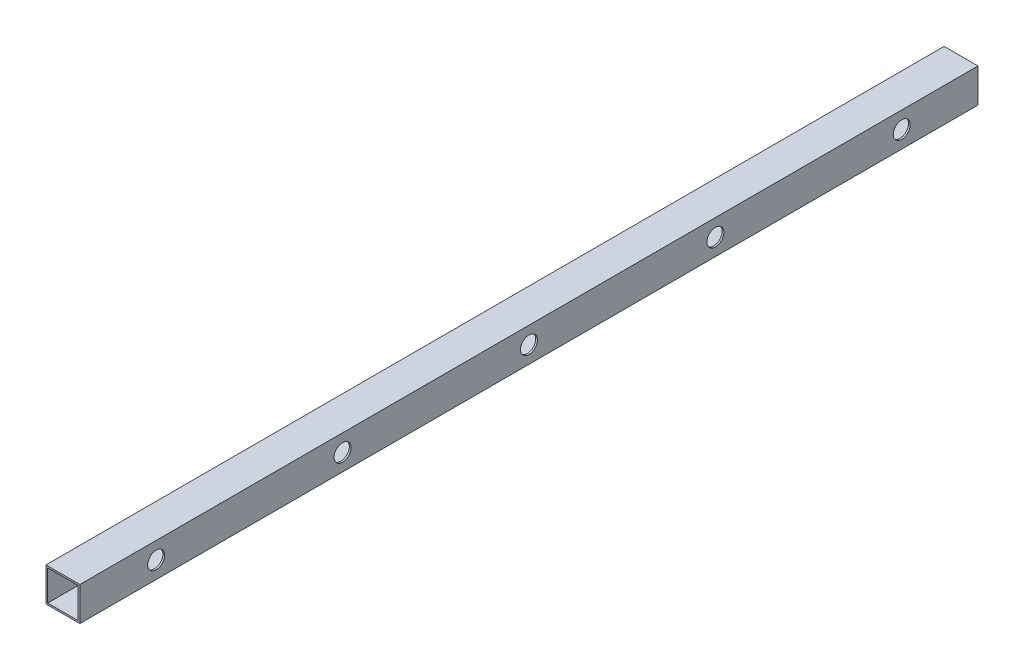
ISO-10303-21;
HEADER;
FILE_DESCRIPTION(('STEP AP214'),'2;1');
FILE_NAME('part.step','',(''),(''),'','','');
FILE_SCHEMA(('AUTOMOTIVE_DESIGN { 1 0 10303 214 1 1 1 1 }'));
ENDSEC;
DATA;
#1=APPLICATION_CONTEXT('core data for automotive mechanical design processes');
#2=APPLICATION_PROTOCOL_DEFINITION('international standard','automotive_design',2000,#1);
#3=PRODUCT_CONTEXT('',#1,'mechanical');
#4=PRODUCT('Part','Part','',(#3));
#5=PRODUCT_RELATED_PRODUCT_CATEGORY('part','',(#4));
#6=PRODUCT_DEFINITION_FORMATION('','',#4);
#7=PRODUCT_DEFINITION_CONTEXT('part definition',#1,'design');
#8=PRODUCT_DEFINITION('design','',#6,#7);
#9=PRODUCT_DEFINITION_SHAPE('','',#8);
#10=(LENGTH_UNIT() NAMED_UNIT(*) SI_UNIT(.MILLI.,.METRE.));
#11=(NAMED_UNIT(*) PLANE_ANGLE_UNIT() SI_UNIT($,.RADIAN.));
#12=(NAMED_UNIT(*) SI_UNIT($,.STERADIAN.) SOLID_ANGLE_UNIT());
#13=UNCERTAINTY_MEASURE_WITH_UNIT(LENGTH_MEASURE(1.E-05),#10,'distance_accuracy_value','');
#14=(GEOMETRIC_REPRESENTATION_CONTEXT(3) GLOBAL_UNCERTAINTY_ASSIGNED_CONTEXT((#13)) GLOBAL_UNIT_ASSIGNED_CONTEXT((#10,
#11,#12)) REPRESENTATION_CONTEXT('',''));
#15=CARTESIAN_POINT('',(0.,0.,0.));
#16=DIRECTION('',(0.,0.,1.));
#17=DIRECTION('',(1.,0.,0.));
#18=AXIS2_PLACEMENT_3D('',#15,#16,#17);
#19=CARTESIAN_POINT('',(-20.,-20.,1060.));
#20=DIRECTION('',(0.,0.,1.));
#21=DIRECTION('',(1.,0.,0.));
#22=AXIS2_PLACEMENT_3D('',#19,#20,#21);
#23=PLANE('',#22);
#24=DIRECTION('',(0.,-1.,0.));
#25=VECTOR('',#24,1.);
#26=CARTESIAN_POINT('',(-20.,-20.,1060.));
#27=LINE('',#26,#25);
#28=CARTESIAN_POINT('',(-20.,20.,1060.));
#29=VERTEX_POINT('',#28);
#30=CARTESIAN_POINT('',(-20.,-20.,1060.));
#31=VERTEX_POINT('',#30);
#32=EDGE_CURVE('E161',#29,#31,#27,.T.);
#33=ORIENTED_EDGE('',*,*,#32,.T.);
#34=DIRECTION('',(1.,0.,0.));
#35=VECTOR('',#34,1.);
#36=CARTESIAN_POINT('',(20.,-20.,1060.));
#37=LINE('',#36,#35);
#38=CARTESIAN_POINT('',(20.,-20.,1060.));
#39=VERTEX_POINT('',#38);
#40=EDGE_CURVE('E164',#31,#39,#37,.T.);
#41=ORIENTED_EDGE('',*,*,#40,.T.);
#42=DIRECTION('',(0.,1.,0.));
#43=VECTOR('',#42,1.);
#44=CARTESIAN_POINT('',(20.,-20.,1060.));
#45=LINE('',#44,#43);
#46=CARTESIAN_POINT('',(20.,20.,1060.));
#47=VERTEX_POINT('',#46);
#48=EDGE_CURVE('E167',#39,#47,#45,.T.);
#49=ORIENTED_EDGE('',*,*,#48,.T.);
#50=DIRECTION('',(-1.,0.,0.));
#51=VECTOR('',#50,1.);
#52=CARTESIAN_POINT('',(20.,20.,1060.));
#53=LINE('',#52,#51);
#54=EDGE_CURVE('E169',#47,#29,#53,.T.);
#55=ORIENTED_EDGE('',*,*,#54,.T.);
#56=EDGE_LOOP('',(#33,#41,#49,#55));
#57=FACE_BOUND('',#56,.T.);
#58=DIRECTION('',(1.,0.,0.));
#59=VECTOR('',#58,1.);
#60=CARTESIAN_POINT('',(20.,-18.,1060.));
#61=LINE('',#60,#59);
#62=CARTESIAN_POINT('',(-18.,-18.,1060.));
#63=VERTEX_POINT('',#62);
#64=CARTESIAN_POINT('',(18.,-18.,1060.));
#65=VERTEX_POINT('',#64);
#66=EDGE_CURVE('E131',#63,#65,#61,.T.);
#67=ORIENTED_EDGE('',*,*,#66,.F.);
#68=DIRECTION('',(0.,-1.,0.));
#69=VECTOR('',#68,1.);
#70=CARTESIAN_POINT('',(-18.,-20.,1060.));
#71=LINE('',#70,#69);
#72=CARTESIAN_POINT('',(-18.,18.,1060.));
#73=VERTEX_POINT('',#72);
#74=EDGE_CURVE('E123',#73,#63,#71,.T.);
#75=ORIENTED_EDGE('',*,*,#74,.F.);
#76=DIRECTION('',(-1.,0.,0.));
#77=VECTOR('',#76,1.);
#78=CARTESIAN_POINT('',(20.,18.,1060.));
#79=LINE('',#78,#77);
#80=CARTESIAN_POINT('',(18.,18.,1060.));
#81=VERTEX_POINT('',#80);
#82=EDGE_CURVE('E145',#81,#73,#79,.T.);
#83=ORIENTED_EDGE('',*,*,#82,.F.);
#84=DIRECTION('',(0.,1.,0.));
#85=VECTOR('',#84,1.);
#86=CARTESIAN_POINT('',(18.,-20.,1060.));
#87=LINE('',#86,#85);
#88=EDGE_CURVE('E143',#65,#81,#87,.T.);
#89=ORIENTED_EDGE('',*,*,#88,.F.);
#90=EDGE_LOOP('',(#67,#75,#83,#89));
#91=FACE_BOUND('',#90,.T.);
#92=ADVANCED_FACE('F56',(#57,#91),#23,.T.);
#93=CARTESIAN_POINT('',(-20.,-20.,0.));
#94=DIRECTION('',(0.,0.,1.));
#95=DIRECTION('',(1.,0.,0.));
#96=AXIS2_PLACEMENT_3D('',#93,#94,#95);
#97=PLANE('',#96);
#98=DIRECTION('',(0.,-1.,0.));
#99=VECTOR('',#98,1.);
#100=CARTESIAN_POINT('',(-20.,-20.,0.));
#101=LINE('',#100,#99);
#102=CARTESIAN_POINT('',(-20.,20.,0.));
#103=VERTEX_POINT('',#102);
#104=CARTESIAN_POINT('',(-20.,-20.,0.));
#105=VERTEX_POINT('',#104);
#106=EDGE_CURVE('E139',#103,#105,#101,.T.);
#107=ORIENTED_EDGE('',*,*,#106,.F.);
#108=DIRECTION('',(-1.,0.,0.));
#109=VECTOR('',#108,1.);
#110=CARTESIAN_POINT('',(20.,20.,0.));
#111=LINE('',#110,#109);
#112=CARTESIAN_POINT('',(20.,20.,0.));
#113=VERTEX_POINT('',#112);
#114=EDGE_CURVE('E165',#113,#103,#111,.T.);
#115=ORIENTED_EDGE('',*,*,#114,.F.);
#116=DIRECTION('',(0.,1.,0.));
#117=VECTOR('',#116,1.);
#118=CARTESIAN_POINT('',(20.,-20.,0.));
#119=LINE('',#118,#117);
#120=CARTESIAN_POINT('',(20.,-20.,0.));
#121=VERTEX_POINT('',#120);
#122=EDGE_CURVE('E176',#121,#113,#119,.T.);
#123=ORIENTED_EDGE('',*,*,#122,.F.);
#124=DIRECTION('',(1.,0.,0.));
#125=VECTOR('',#124,1.);
#126=CARTESIAN_POINT('',(20.,-20.,0.));
#127=LINE('',#126,#125);
#128=EDGE_CURVE('E174',#105,#121,#127,.T.);
#129=ORIENTED_EDGE('',*,*,#128,.F.);
#130=EDGE_LOOP('',(#107,#115,#123,#129));
#131=FACE_BOUND('',#130,.T.);
#132=DIRECTION('',(0.,-1.,0.));
#133=VECTOR('',#132,1.);
#134=CARTESIAN_POINT('',(-18.,-20.,0.));
#135=LINE('',#134,#133);
#136=CARTESIAN_POINT('',(-18.,18.,0.));
#137=VERTEX_POINT('',#136);
#138=CARTESIAN_POINT('',(-18.,-18.,0.));
#139=VERTEX_POINT('',#138);
#140=EDGE_CURVE('E81',#137,#139,#135,.T.);
#141=ORIENTED_EDGE('',*,*,#140,.T.);
#142=DIRECTION('',(1.,0.,0.));
#143=VECTOR('',#142,1.);
#144=CARTESIAN_POINT('',(20.,-18.,0.));
#145=LINE('',#144,#143);
#146=CARTESIAN_POINT('',(18.,-18.,0.));
#147=VERTEX_POINT('',#146);
#148=EDGE_CURVE('E138',#139,#147,#145,.T.);
#149=ORIENTED_EDGE('',*,*,#148,.T.);
#150=DIRECTION('',(0.,1.,0.));
#151=VECTOR('',#150,1.);
#152=CARTESIAN_POINT('',(18.,-20.,0.));
#153=LINE('',#152,#151);
#154=CARTESIAN_POINT('',(18.,18.,0.));
#155=VERTEX_POINT('',#154);
#156=EDGE_CURVE('E153',#147,#155,#153,.T.);
#157=ORIENTED_EDGE('',*,*,#156,.T.);
#158=DIRECTION('',(-1.,0.,0.));
#159=VECTOR('',#158,1.);
#160=CARTESIAN_POINT('',(20.,18.,0.));
#161=LINE('',#160,#159);
#162=EDGE_CURVE('E132',#155,#137,#161,.T.);
#163=ORIENTED_EDGE('',*,*,#162,.T.);
#164=EDGE_LOOP('',(#141,#149,#157,#163));
#165=FACE_BOUND('',#164,.T.);
#166=ADVANCED_FACE('F234',(#131,#165),#97,.F.);
#167=CARTESIAN_POINT('',(-20.,-20.,1060.));
#168=DIRECTION('',(1.,0.,0.));
#169=DIRECTION('',(0.,0.,-1.));
#170=AXIS2_PLACEMENT_3D('',#167,#168,#169);
#171=PLANE('',#170);
#172=ORIENTED_EDGE('',*,*,#106,.T.);
#173=DIRECTION('',(0.,0.,-1.));
#174=VECTOR('',#173,1.);
#175=CARTESIAN_POINT('',(-20.,-20.,1060.));
#176=LINE('',#175,#174);
#177=EDGE_CURVE('E12',#31,#105,#176,.T.);
#178=ORIENTED_EDGE('',*,*,#177,.F.);
#179=ORIENTED_EDGE('',*,*,#32,.F.);
#180=DIRECTION('',(0.,0.,-1.));
#181=VECTOR('',#180,1.);
#182=CARTESIAN_POINT('',(-20.,20.,1060.));
#183=LINE('',#182,#181);
#184=EDGE_CURVE('E171',#29,#103,#183,.T.);
#185=ORIENTED_EDGE('',*,*,#184,.T.);
#186=EDGE_LOOP('',(#172,#178,#179,#185));
#187=FACE_BOUND('',#186,.T.);
#188=ADVANCED_FACE('F58',(#187),#171,.F.);
#189=CARTESIAN_POINT('',(20.,-20.,1060.));
#190=DIRECTION('',(0.,1.,0.));
#191=DIRECTION('',(-1.,0.,0.));
#192=AXIS2_PLACEMENT_3D('',#189,#190,#191);
#193=PLANE('',#192);
#194=ORIENTED_EDGE('',*,*,#128,.T.);
#195=DIRECTION('',(0.,0.,-1.));
#196=VECTOR('',#195,1.);
#197=CARTESIAN_POINT('',(20.,-20.,1060.));
#198=LINE('',#197,#196);
#199=EDGE_CURVE('E65',#39,#121,#198,.T.);
#200=ORIENTED_EDGE('',*,*,#199,.F.);
#201=ORIENTED_EDGE('',*,*,#40,.F.);
#202=ORIENTED_EDGE('',*,*,#177,.T.);
#203=EDGE_LOOP('',(#194,#200,#201,#202));
#204=FACE_BOUND('',#203,.T.);
#205=ADVANCED_FACE('F221',(#204),#193,.F.);
#206=CARTESIAN_POINT('',(20.,-20.,1060.));
#207=DIRECTION('',(-1.,0.,0.));
#208=DIRECTION('',(0.,0.,1.));
#209=AXIS2_PLACEMENT_3D('',#206,#207,#208);
#210=PLANE('',#209);
#211=CARTESIAN_POINT('',(20.,-3.07077063430028E-12,970.));
#212=DIRECTION('',(1.,0.,0.));
#213=DIRECTION('',(0.,0.,-1.));
#214=AXIS2_PLACEMENT_3D('',#211,#212,#213);
#215=CIRCLE('',#214,9.99999999999988);
#216=CARTESIAN_POINT('',(20.,-3.07077063430028E-12,960.));
#217=VERTEX_POINT('',#216);
#218=EDGE_CURVE('E208',#217,#217,#215,.T.);
#219=ORIENTED_EDGE('',*,*,#218,.F.);
#220=EDGE_LOOP('',(#219));
#221=FACE_BOUND('',#220,.T.);
#222=CARTESIAN_POINT('',(20.,-1.53451795541215E-12,750.));
#223=DIRECTION('',(1.,0.,0.));
#224=DIRECTION('',(0.,0.,-1.));
#225=AXIS2_PLACEMENT_3D('',#222,#223,#224);
#226=CIRCLE('',#225,9.99999999999998);
#227=CARTESIAN_POINT('',(20.,-1.53451795541215E-12,740.));
#228=VERTEX_POINT('',#227);
#229=EDGE_CURVE('E198',#228,#228,#226,.T.);
#230=ORIENTED_EDGE('',*,*,#229,.F.);
#231=EDGE_LOOP('',(#230));
#232=FACE_BOUND('',#231,.T.);
#233=CARTESIAN_POINT('',(20.,0.,90.));
#234=DIRECTION('',(1.,0.,0.));
#235=DIRECTION('',(0.,0.,-1.));
#236=AXIS2_PLACEMENT_3D('',#233,#234,#235);
#237=CIRCLE('',#236,9.99999999999998);
#238=CARTESIAN_POINT('',(20.,0.,80.));
#239=VERTEX_POINT('',#238);
#240=EDGE_CURVE('E195',#239,#239,#237,.T.);
#241=ORIENTED_EDGE('',*,*,#240,.F.);
#242=EDGE_LOOP('',(#241));
#243=FACE_BOUND('',#242,.T.);
#244=CARTESIAN_POINT('',(20.,0.,310.));
#245=DIRECTION('',(1.,0.,0.));
#246=DIRECTION('',(0.,0.,-1.));
#247=AXIS2_PLACEMENT_3D('',#244,#245,#246);
#248=CIRCLE('',#247,9.99999999999998);
#249=CARTESIAN_POINT('',(20.,0.,300.));
#250=VERTEX_POINT('',#249);
#251=EDGE_CURVE('E192',#250,#250,#248,.T.);
#252=ORIENTED_EDGE('',*,*,#251,.F.);
#253=EDGE_LOOP('',(#252));
#254=FACE_BOUND('',#253,.T.);
#255=CARTESIAN_POINT('',(20.,0.,530.));
#256=DIRECTION('',(1.,0.,0.));
#257=DIRECTION('',(0.,0.,-1.));
#258=AXIS2_PLACEMENT_3D('',#255,#256,#257);
#259=CIRCLE('',#258,9.99999999999998);
#260=CARTESIAN_POINT('',(20.,0.,520.));
#261=VERTEX_POINT('',#260);
#262=EDGE_CURVE('E188',#261,#261,#259,.T.);
#263=ORIENTED_EDGE('',*,*,#262,.F.);
#264=EDGE_LOOP('',(#263));
#265=FACE_BOUND('',#264,.T.);
#266=ORIENTED_EDGE('',*,*,#122,.T.);
#267=DIRECTION('',(0.,0.,-1.));
#268=VECTOR('',#267,1.);
#269=CARTESIAN_POINT('',(20.,20.,1060.));
#270=LINE('',#269,#268);
#271=EDGE_CURVE('E181',#47,#113,#270,.T.);
#272=ORIENTED_EDGE('',*,*,#271,.F.);
#273=ORIENTED_EDGE('',*,*,#48,.F.);
#274=ORIENTED_EDGE('',*,*,#199,.T.);
#275=EDGE_LOOP('',(#266,#272,#273,#274));
#276=FACE_BOUND('',#275,.T.);
#277=ADVANCED_FACE('F217',(#221,#232,#243,#254,#265,#276),#210,.F.);
#278=CARTESIAN_POINT('',(20.,20.,1060.));
#279=DIRECTION('',(0.,-1.,0.));
#280=DIRECTION('',(1.,0.,0.));
#281=AXIS2_PLACEMENT_3D('',#278,#279,#280);
#282=PLANE('',#281);
#283=ORIENTED_EDGE('',*,*,#114,.T.);
#284=ORIENTED_EDGE('',*,*,#184,.F.);
#285=ORIENTED_EDGE('',*,*,#54,.F.);
#286=ORIENTED_EDGE('',*,*,#271,.T.);
#287=EDGE_LOOP('',(#283,#284,#285,#286));
#288=FACE_BOUND('',#287,.T.);
#289=ADVANCED_FACE('F220',(#288),#282,.F.);
#290=CARTESIAN_POINT('',(-18.,-20.,1060.));
#291=DIRECTION('',(1.,0.,0.));
#292=DIRECTION('',(0.,0.,-1.));
#293=AXIS2_PLACEMENT_3D('',#290,#291,#292);
#294=PLANE('',#293);
#295=ORIENTED_EDGE('',*,*,#140,.F.);
#296=DIRECTION('',(0.,0.,-1.));
#297=VECTOR('',#296,1.);
#298=CARTESIAN_POINT('',(-18.,18.,1060.));
#299=LINE('',#298,#297);
#300=EDGE_CURVE('E127',#73,#137,#299,.T.);
#301=ORIENTED_EDGE('',*,*,#300,.F.);
#302=ORIENTED_EDGE('',*,*,#74,.T.);
#303=DIRECTION('',(0.,0.,-1.));
#304=VECTOR('',#303,1.);
#305=CARTESIAN_POINT('',(-18.,-18.,1060.));
#306=LINE('',#305,#304);
#307=EDGE_CURVE('E126',#63,#139,#306,.T.);
#308=ORIENTED_EDGE('',*,*,#307,.T.);
#309=EDGE_LOOP('',(#295,#301,#302,#308));
#310=FACE_BOUND('',#309,.T.);
#311=ADVANCED_FACE('F125',(#310),#294,.T.);
#312=CARTESIAN_POINT('',(20.,-18.,1060.));
#313=DIRECTION('',(0.,1.,0.));
#314=DIRECTION('',(-1.,0.,0.));
#315=AXIS2_PLACEMENT_3D('',#312,#313,#314);
#316=PLANE('',#315);
#317=ORIENTED_EDGE('',*,*,#148,.F.);
#318=ORIENTED_EDGE('',*,*,#307,.F.);
#319=ORIENTED_EDGE('',*,*,#66,.T.);
#320=DIRECTION('',(0.,0.,-1.));
#321=VECTOR('',#320,1.);
#322=CARTESIAN_POINT('',(18.,-18.,1060.));
#323=LINE('',#322,#321);
#324=EDGE_CURVE('E140',#65,#147,#323,.T.);
#325=ORIENTED_EDGE('',*,*,#324,.T.);
#326=EDGE_LOOP('',(#317,#318,#319,#325));
#327=FACE_BOUND('',#326,.T.);
#328=ADVANCED_FACE('F135',(#327),#316,.T.);
#329=CARTESIAN_POINT('',(18.,-20.,1060.));
#330=DIRECTION('',(-1.,0.,0.));
#331=DIRECTION('',(0.,0.,1.));
#332=AXIS2_PLACEMENT_3D('',#329,#330,#331);
#333=PLANE('',#332);
#334=CARTESIAN_POINT('',(18.,-3.07077063430028E-12,970.));
#335=DIRECTION('',(-1.,0.,0.));
#336=DIRECTION('',(0.,0.,1.));
#337=AXIS2_PLACEMENT_3D('',#334,#335,#336);
#338=CIRCLE('',#337,9.99999999999988);
#339=CARTESIAN_POINT('',(18.,-3.07077063430028E-12,980.));
#340=VERTEX_POINT('',#339);
#341=EDGE_CURVE('E60',#340,#340,#338,.T.);
#342=ORIENTED_EDGE('',*,*,#341,.F.);
#343=EDGE_LOOP('',(#342));
#344=FACE_BOUND('',#343,.T.);
#345=CARTESIAN_POINT('',(18.,-1.53451795541215E-12,750.));
#346=DIRECTION('',(-1.,0.,0.));
#347=DIRECTION('',(0.,0.,1.));
#348=AXIS2_PLACEMENT_3D('',#345,#346,#347);
#349=CIRCLE('',#348,9.99999999999998);
#350=CARTESIAN_POINT('',(18.,-1.53451795541215E-12,760.));
#351=VERTEX_POINT('',#350);
#352=EDGE_CURVE('E196',#351,#351,#349,.T.);
#353=ORIENTED_EDGE('',*,*,#352,.F.);
#354=EDGE_LOOP('',(#353));
#355=FACE_BOUND('',#354,.T.);
#356=CARTESIAN_POINT('',(18.,0.,90.));
#357=DIRECTION('',(-1.,0.,0.));
#358=DIRECTION('',(0.,0.,1.));
#359=AXIS2_PLACEMENT_3D('',#356,#357,#358);
#360=CIRCLE('',#359,9.99999999999998);
#361=CARTESIAN_POINT('',(18.,0.,100.));
#362=VERTEX_POINT('',#361);
#363=EDGE_CURVE('E193',#362,#362,#360,.T.);
#364=ORIENTED_EDGE('',*,*,#363,.F.);
#365=EDGE_LOOP('',(#364));
#366=FACE_BOUND('',#365,.T.);
#367=CARTESIAN_POINT('',(18.,0.,310.));
#368=DIRECTION('',(-1.,0.,0.));
#369=DIRECTION('',(0.,0.,1.));
#370=AXIS2_PLACEMENT_3D('',#367,#368,#369);
#371=CIRCLE('',#370,9.99999999999998);
#372=CARTESIAN_POINT('',(18.,0.,320.));
#373=VERTEX_POINT('',#372);
#374=EDGE_CURVE('E189',#373,#373,#371,.T.);
#375=ORIENTED_EDGE('',*,*,#374,.F.);
#376=EDGE_LOOP('',(#375));
#377=FACE_BOUND('',#376,.T.);
#378=CARTESIAN_POINT('',(18.,0.,530.));
#379=DIRECTION('',(-1.,0.,0.));
#380=DIRECTION('',(0.,0.,1.));
#381=AXIS2_PLACEMENT_3D('',#378,#379,#380);
#382=CIRCLE('',#381,9.99999999999998);
#383=CARTESIAN_POINT('',(18.,0.,540.));
#384=VERTEX_POINT('',#383);
#385=EDGE_CURVE('E151',#384,#384,#382,.T.);
#386=ORIENTED_EDGE('',*,*,#385,.F.);
#387=EDGE_LOOP('',(#386));
#388=FACE_BOUND('',#387,.T.);
#389=ORIENTED_EDGE('',*,*,#156,.F.);
#390=ORIENTED_EDGE('',*,*,#324,.F.);
#391=ORIENTED_EDGE('',*,*,#88,.T.);
#392=DIRECTION('',(0.,0.,-1.));
#393=VECTOR('',#392,1.);
#394=CARTESIAN_POINT('',(18.,18.,1060.));
#395=LINE('',#394,#393);
#396=EDGE_CURVE('E73',#81,#155,#395,.T.);
#397=ORIENTED_EDGE('',*,*,#396,.T.);
#398=EDGE_LOOP('',(#389,#390,#391,#397));
#399=FACE_BOUND('',#398,.T.);
#400=ADVANCED_FACE('F261',(#344,#355,#366,#377,#388,#399),#333,.T.);
#401=CARTESIAN_POINT('',(20.,18.,1060.));
#402=DIRECTION('',(0.,-1.,0.));
#403=DIRECTION('',(1.,0.,0.));
#404=AXIS2_PLACEMENT_3D('',#401,#402,#403);
#405=PLANE('',#404);
#406=ORIENTED_EDGE('',*,*,#162,.F.);
#407=ORIENTED_EDGE('',*,*,#396,.F.);
#408=ORIENTED_EDGE('',*,*,#82,.T.);
#409=ORIENTED_EDGE('',*,*,#300,.T.);
#410=EDGE_LOOP('',(#406,#407,#408,#409));
#411=FACE_BOUND('',#410,.T.);
#412=ADVANCED_FACE('F265',(#411),#405,.T.);
#413=CARTESIAN_POINT('',(10.,0.,530.));
#414=DIRECTION('',(1.,0.,0.));
#415=DIRECTION('',(0.,0.,-1.));
#416=AXIS2_PLACEMENT_3D('',#413,#414,#415);
#417=CYLINDRICAL_SURFACE('',#416,9.99999999999998);
#418=ORIENTED_EDGE('',*,*,#385,.T.);
#419=EDGE_LOOP('',(#418));
#420=FACE_BOUND('',#419,.T.);
#421=ORIENTED_EDGE('',*,*,#262,.T.);
#422=EDGE_LOOP('',(#421));
#423=FACE_BOUND('',#422,.T.);
#424=ADVANCED_FACE('F215',(#420,#423),#417,.F.);
#425=CARTESIAN_POINT('',(10.,0.,310.));
#426=DIRECTION('',(1.,0.,0.));
#427=DIRECTION('',(0.,0.,-1.));
#428=AXIS2_PLACEMENT_3D('',#425,#426,#427);
#429=CYLINDRICAL_SURFACE('',#428,9.99999999999998);
#430=ORIENTED_EDGE('',*,*,#374,.T.);
#431=EDGE_LOOP('',(#430));
#432=FACE_BOUND('',#431,.T.);
#433=ORIENTED_EDGE('',*,*,#251,.T.);
#434=EDGE_LOOP('',(#433));
#435=FACE_BOUND('',#434,.T.);
#436=ADVANCED_FACE('F273',(#432,#435),#429,.F.);
#437=CARTESIAN_POINT('',(10.,0.,90.));
#438=DIRECTION('',(1.,0.,0.));
#439=DIRECTION('',(0.,0.,-1.));
#440=AXIS2_PLACEMENT_3D('',#437,#438,#439);
#441=CYLINDRICAL_SURFACE('',#440,9.99999999999998);
#442=ORIENTED_EDGE('',*,*,#363,.T.);
#443=EDGE_LOOP('',(#442));
#444=FACE_BOUND('',#443,.T.);
#445=ORIENTED_EDGE('',*,*,#240,.T.);
#446=EDGE_LOOP('',(#445));
#447=FACE_BOUND('',#446,.T.);
#448=ADVANCED_FACE('F277',(#444,#447),#441,.F.);
#449=CARTESIAN_POINT('',(10.,-1.53451795541215E-12,750.));
#450=DIRECTION('',(1.,0.,0.));
#451=DIRECTION('',(0.,0.,-1.));
#452=AXIS2_PLACEMENT_3D('',#449,#450,#451);
#453=CYLINDRICAL_SURFACE('',#452,9.99999999999998);
#454=ORIENTED_EDGE('',*,*,#352,.T.);
#455=EDGE_LOOP('',(#454));
#456=FACE_BOUND('',#455,.T.);
#457=ORIENTED_EDGE('',*,*,#229,.T.);
#458=EDGE_LOOP('',(#457));
#459=FACE_BOUND('',#458,.T.);
#460=ADVANCED_FACE('F281',(#456,#459),#453,.F.);
#461=CARTESIAN_POINT('',(10.,-3.07077063430028E-12,970.));
#462=DIRECTION('',(1.,0.,0.));
#463=DIRECTION('',(0.,0.,-1.));
#464=AXIS2_PLACEMENT_3D('',#461,#462,#463);
#465=CYLINDRICAL_SURFACE('',#464,9.99999999999988);
#466=ORIENTED_EDGE('',*,*,#341,.T.);
#467=EDGE_LOOP('',(#466));
#468=FACE_BOUND('',#467,.T.);
#469=ORIENTED_EDGE('',*,*,#218,.T.);
#470=EDGE_LOOP('',(#469));
#471=FACE_BOUND('',#470,.T.);
#472=ADVANCED_FACE('F285',(#468,#471),#465,.F.);
#473=CLOSED_SHELL('',(#92,#166,#188,#205,#277,#289,#311,#328,#400,#412,#424,#436,#448,#460,#472));
#474=MANIFOLD_SOLID_BREP('B2',#473);
#475=ADVANCED_BREP_SHAPE_REPRESENTATION('',(#18,#474),#14);
#476=SHAPE_DEFINITION_REPRESENTATION(#9,#475);
ENDSEC;
END-ISO-10303-21;
